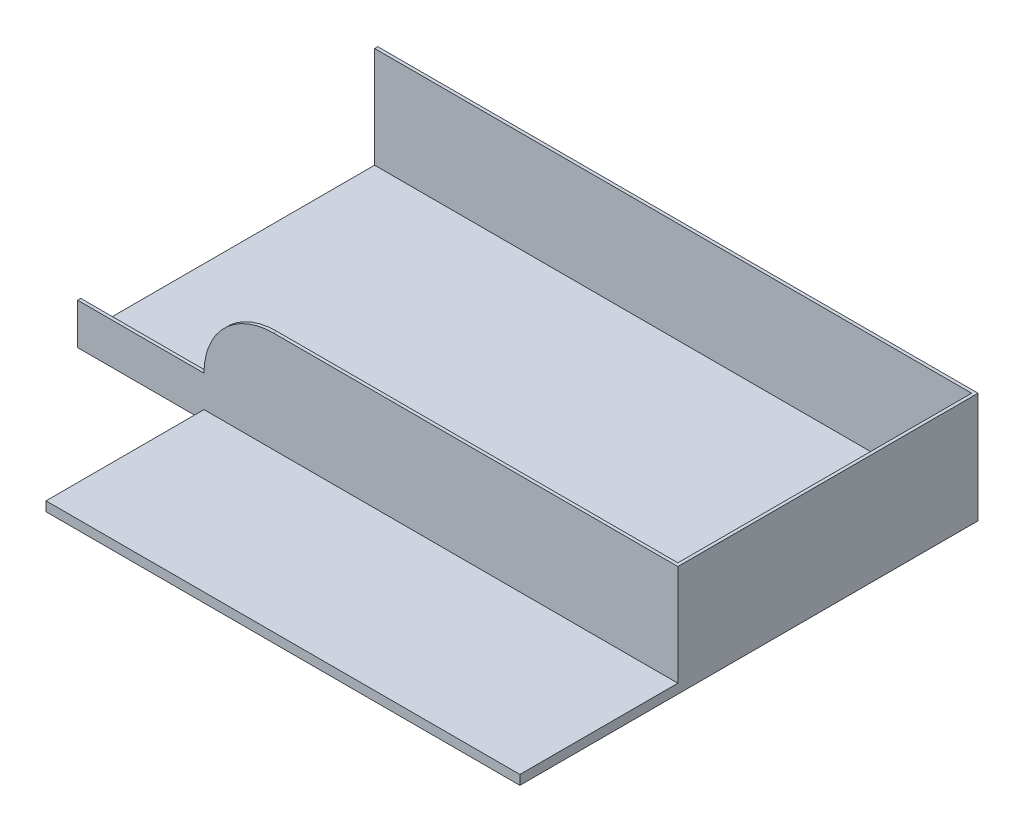
ISO-10303-21;
HEADER;
FILE_DESCRIPTION(('STEP AP214'),'2;1');
FILE_NAME('part.step','',(''),(''),'','','');
FILE_SCHEMA(('AUTOMOTIVE_DESIGN { 1 0 10303 214 1 1 1 1 }'));
ENDSEC;
DATA;
#1=APPLICATION_CONTEXT('core data for automotive mechanical design processes');
#2=APPLICATION_PROTOCOL_DEFINITION('international standard','automotive_design',2000,#1);
#3=PRODUCT_CONTEXT('',#1,'mechanical');
#4=PRODUCT('Part','Part','',(#3));
#5=PRODUCT_RELATED_PRODUCT_CATEGORY('part','',(#4));
#6=PRODUCT_DEFINITION_FORMATION('','',#4);
#7=PRODUCT_DEFINITION_CONTEXT('part definition',#1,'design');
#8=PRODUCT_DEFINITION('design','',#6,#7);
#9=PRODUCT_DEFINITION_SHAPE('','',#8);
#10=(LENGTH_UNIT() NAMED_UNIT(*) SI_UNIT(.MILLI.,.METRE.));
#11=(NAMED_UNIT(*) PLANE_ANGLE_UNIT() SI_UNIT($,.RADIAN.));
#12=(NAMED_UNIT(*) SI_UNIT($,.STERADIAN.) SOLID_ANGLE_UNIT());
#13=UNCERTAINTY_MEASURE_WITH_UNIT(LENGTH_MEASURE(1.E-05),#10,'distance_accuracy_value','');
#14=(GEOMETRIC_REPRESENTATION_CONTEXT(3) GLOBAL_UNCERTAINTY_ASSIGNED_CONTEXT((#13)) GLOBAL_UNIT_ASSIGNED_CONTEXT((#10,
#11,#12)) REPRESENTATION_CONTEXT('',''));
#15=CARTESIAN_POINT('',(0.,0.,0.));
#16=DIRECTION('',(0.,0.,1.));
#17=DIRECTION('',(1.,0.,0.));
#18=AXIS2_PLACEMENT_3D('',#15,#16,#17);
#19=CARTESIAN_POINT('',(0.,30.,0.));
#20=DIRECTION('',(0.,-1.,0.));
#21=DIRECTION('',(0.,0.,-1.));
#22=AXIS2_PLACEMENT_3D('',#19,#20,#21);
#23=PLANE('',#22);
#24=DIRECTION('',(1.,0.,0.));
#25=VECTOR('',#24,1.);
#26=CARTESIAN_POINT('',(0.,30.,940.));
#27=LINE('',#26,#25);
#28=CARTESIAN_POINT('',(1.16341445918999E-13,30.,940.));
#29=VERTEX_POINT('',#28);
#30=CARTESIAN_POINT('',(1890.,30.,940.));
#31=VERTEX_POINT('',#30);
#32=EDGE_CURVE('E164',#29,#31,#27,.T.);
#33=ORIENTED_EDGE('',*,*,#32,.T.);
#34=DIRECTION('',(0.,0.,1.));
#35=VECTOR('',#34,1.);
#36=CARTESIAN_POINT('',(1890.,30.,-4.46451386498201E-13));
#37=LINE('',#36,#35);
#38=CARTESIAN_POINT('',(1890.,30.,10.));
#39=VERTEX_POINT('',#38);
#40=EDGE_CURVE('E58',#39,#31,#37,.T.);
#41=ORIENTED_EDGE('',*,*,#40,.F.);
#42=DIRECTION('',(1.,0.,0.));
#43=VECTOR('',#42,1.);
#44=CARTESIAN_POINT('',(0.,30.,10.));
#45=LINE('',#44,#43);
#46=CARTESIAN_POINT('',(0.,30.,10.));
#47=VERTEX_POINT('',#46);
#48=EDGE_CURVE('E215',#47,#39,#45,.T.);
#49=ORIENTED_EDGE('',*,*,#48,.F.);
#50=DIRECTION('',(0.,0.,1.));
#51=VECTOR('',#50,1.);
#52=CARTESIAN_POINT('',(0.,30.,0.));
#53=LINE('',#52,#51);
#54=EDGE_CURVE('E218',#47,#29,#53,.T.);
#55=ORIENTED_EDGE('',*,*,#54,.T.);
#56=EDGE_LOOP('',(#33,#41,#49,#55));
#57=FACE_BOUND('',#56,.T.);
#58=ADVANCED_FACE('F35',(#57),#23,.F.);
#59=CARTESIAN_POINT('',(1890.,350.,-4.46451386498201E-13));
#60=DIRECTION('',(1.,0.,0.));
#61=DIRECTION('',(0.,0.,-1.));
#62=AXIS2_PLACEMENT_3D('',#59,#60,#61);
#63=PLANE('',#62);
#64=DIRECTION('',(0.,-1.,0.));
#65=VECTOR('',#64,1.);
#66=CARTESIAN_POINT('',(1890.,350.,940.));
#67=LINE('',#66,#65);
#68=CARTESIAN_POINT('',(1890.,350.,940.));
#69=VERTEX_POINT('',#68);
#70=EDGE_CURVE('E169',#69,#31,#67,.T.);
#71=ORIENTED_EDGE('',*,*,#70,.F.);
#72=DIRECTION('',(0.,0.,1.));
#73=VECTOR('',#72,1.);
#74=CARTESIAN_POINT('',(1890.,350.,-4.46451386498201E-13));
#75=LINE('',#74,#73);
#76=CARTESIAN_POINT('',(1890.,350.,10.));
#77=VERTEX_POINT('',#76);
#78=EDGE_CURVE('E195',#77,#69,#75,.T.);
#79=ORIENTED_EDGE('',*,*,#78,.F.);
#80=DIRECTION('',(0.,-1.,0.));
#81=VECTOR('',#80,1.);
#82=CARTESIAN_POINT('',(1890.,350.,10.));
#83=LINE('',#82,#81);
#84=EDGE_CURVE('E211',#77,#39,#83,.T.);
#85=ORIENTED_EDGE('',*,*,#84,.T.);
#86=ORIENTED_EDGE('',*,*,#40,.T.);
#87=EDGE_LOOP('',(#71,#79,#85,#86));
#88=FACE_BOUND('',#87,.T.);
#89=ADVANCED_FACE('F271',(#88),#63,.F.);
#90=DIRECTION('',(1.,0.,0.));
#91=VECTOR('',#90,1.);
#92=CARTESIAN_POINT('',(-2.22044604925031E-13,30.,950.));
#93=LINE('',#92,#91);
#94=CARTESIAN_POINT('',(400.,30.,950.));
#95=VERTEX_POINT('',#94);
#96=CARTESIAN_POINT('',(1900.,30.,950.));
#97=VERTEX_POINT('',#96);
#98=EDGE_CURVE('E11',#95,#97,#93,.T.);
#99=ORIENTED_EDGE('',*,*,#98,.F.);
#100=DIRECTION('',(0.,0.,-1.));
#101=VECTOR('',#100,1.);
#102=CARTESIAN_POINT('',(400.,30.,0.));
#103=LINE('',#102,#101);
#104=CARTESIAN_POINT('',(400.,30.,1450.));
#105=VERTEX_POINT('',#104);
#106=EDGE_CURVE('E177',#105,#95,#103,.T.);
#107=ORIENTED_EDGE('',*,*,#106,.F.);
#108=DIRECTION('',(-1.,0.,0.));
#109=VECTOR('',#108,1.);
#110=CARTESIAN_POINT('',(2.14643118094197E-13,30.,1450.));
#111=LINE('',#110,#109);
#112=CARTESIAN_POINT('',(1900.,30.,1450.));
#113=VERTEX_POINT('',#112);
#114=EDGE_CURVE('E173',#113,#105,#111,.T.);
#115=ORIENTED_EDGE('',*,*,#114,.F.);
#116=DIRECTION('',(0.,0.,1.));
#117=VECTOR('',#116,1.);
#118=CARTESIAN_POINT('',(1900.,30.,0.));
#119=LINE('',#118,#117);
#120=EDGE_CURVE('E51',#97,#113,#119,.T.);
#121=ORIENTED_EDGE('',*,*,#120,.F.);
#122=EDGE_LOOP('',(#99,#107,#115,#121));
#123=FACE_BOUND('',#122,.T.);
#124=ADVANCED_FACE('F258',(#123),#23,.F.);
#125=CARTESIAN_POINT('',(1.16341445918999E-13,30.,950.));
#126=DIRECTION('',(0.,0.,-1.));
#127=DIRECTION('',(-1.,0.,0.));
#128=AXIS2_PLACEMENT_3D('',#125,#126,#127);
#129=PLANE('',#128);
#130=DIRECTION('',(1.,0.,0.));
#131=VECTOR('',#130,1.);
#132=CARTESIAN_POINT('',(-2.22044604925031E-13,350.,950.));
#133=LINE('',#132,#131);
#134=CARTESIAN_POINT('',(620.,350.,950.));
#135=VERTEX_POINT('',#134);
#136=CARTESIAN_POINT('',(1900.,350.,950.));
#137=VERTEX_POINT('',#136);
#138=EDGE_CURVE('E198',#135,#137,#133,.T.);
#139=ORIENTED_EDGE('',*,*,#138,.F.);
#140=CARTESIAN_POINT('',(620.,130.,950.));
#141=DIRECTION('',(0.,0.,1.));
#142=DIRECTION('',(1.,0.,0.));
#143=AXIS2_PLACEMENT_3D('',#140,#141,#142);
#144=CIRCLE('',#143,220.);
#145=CARTESIAN_POINT('',(400.,130.,950.));
#146=VERTEX_POINT('',#145);
#147=EDGE_CURVE('E160',#146,#135,#144,.F.);
#148=ORIENTED_EDGE('',*,*,#147,.F.);
#149=DIRECTION('',(1.,0.,0.));
#150=VECTOR('',#149,1.);
#151=CARTESIAN_POINT('',(0.,130.,950.));
#152=LINE('',#151,#150);
#153=CARTESIAN_POINT('',(-2.22044604925031E-13,130.,950.));
#154=VERTEX_POINT('',#153);
#155=EDGE_CURVE('E149',#154,#146,#152,.T.);
#156=ORIENTED_EDGE('',*,*,#155,.F.);
#157=DIRECTION('',(0.,-1.,0.));
#158=VECTOR('',#157,1.);
#159=CARTESIAN_POINT('',(1.16341445918999E-13,30.,950.));
#160=LINE('',#159,#158);
#161=CARTESIAN_POINT('',(1.16341445918999E-13,0.,950.));
#162=VERTEX_POINT('',#161);
#163=EDGE_CURVE('E221',#154,#162,#160,.T.);
#164=ORIENTED_EDGE('',*,*,#163,.T.);
#165=DIRECTION('',(1.,0.,0.));
#166=VECTOR('',#165,1.);
#167=CARTESIAN_POINT('',(1.16341445918999E-13,0.,950.));
#168=LINE('',#167,#166);
#169=CARTESIAN_POINT('',(400.,0.,950.));
#170=VERTEX_POINT('',#169);
#171=EDGE_CURVE('E217',#162,#170,#168,.T.);
#172=ORIENTED_EDGE('',*,*,#171,.T.);
#173=DIRECTION('',(0.,-1.,0.));
#174=VECTOR('',#173,1.);
#175=CARTESIAN_POINT('',(400.,30.,950.));
#176=LINE('',#175,#174);
#177=EDGE_CURVE('E187',#95,#170,#176,.T.);
#178=ORIENTED_EDGE('',*,*,#177,.F.);
#179=ORIENTED_EDGE('',*,*,#98,.T.);
#180=DIRECTION('',(0.,-1.,0.));
#181=VECTOR('',#180,1.);
#182=CARTESIAN_POINT('',(1900.,30.,950.));
#183=LINE('',#182,#181);
#184=EDGE_CURVE('E39',#137,#97,#183,.T.);
#185=ORIENTED_EDGE('',*,*,#184,.F.);
#186=EDGE_LOOP('',(#139,#148,#156,#164,#172,#178,#179,#185));
#187=FACE_BOUND('',#186,.T.);
#188=ADVANCED_FACE('F37',(#187),#129,.F.);
#189=CARTESIAN_POINT('',(1900.,30.,0.));
#190=DIRECTION('',(1.,0.,0.));
#191=DIRECTION('',(0.,0.,-1.));
#192=AXIS2_PLACEMENT_3D('',#189,#190,#191);
#193=PLANE('',#192);
#194=ORIENTED_EDGE('',*,*,#184,.T.);
#195=ORIENTED_EDGE('',*,*,#120,.T.);
#196=DIRECTION('',(0.,-1.,0.));
#197=VECTOR('',#196,1.);
#198=CARTESIAN_POINT('',(1900.,30.,1450.));
#199=LINE('',#198,#197);
#200=CARTESIAN_POINT('',(1900.,0.,1450.));
#201=VERTEX_POINT('',#200);
#202=EDGE_CURVE('E189',#113,#201,#199,.T.);
#203=ORIENTED_EDGE('',*,*,#202,.T.);
#204=DIRECTION('',(0.,0.,1.));
#205=VECTOR('',#204,1.);
#206=CARTESIAN_POINT('',(1900.,0.,0.));
#207=LINE('',#206,#205);
#208=CARTESIAN_POINT('',(1900.,0.,0.));
#209=VERTEX_POINT('',#208);
#210=EDGE_CURVE('E225',#209,#201,#207,.T.);
#211=ORIENTED_EDGE('',*,*,#210,.F.);
#212=DIRECTION('',(0.,-1.,0.));
#213=VECTOR('',#212,1.);
#214=CARTESIAN_POINT('',(1900.,30.,0.));
#215=LINE('',#214,#213);
#216=CARTESIAN_POINT('',(1900.,350.,0.));
#217=VERTEX_POINT('',#216);
#218=EDGE_CURVE('E234',#217,#209,#215,.T.);
#219=ORIENTED_EDGE('',*,*,#218,.F.);
#220=DIRECTION('',(0.,0.,1.));
#221=VECTOR('',#220,1.);
#222=CARTESIAN_POINT('',(1900.,350.,-4.44089209850062E-13));
#223=LINE('',#222,#221);
#224=EDGE_CURVE('E201',#217,#137,#223,.T.);
#225=ORIENTED_EDGE('',*,*,#224,.T.);
#226=EDGE_LOOP('',(#194,#195,#203,#211,#219,#225));
#227=FACE_BOUND('',#226,.T.);
#228=ADVANCED_FACE('F241',(#227),#193,.T.);
#229=CARTESIAN_POINT('',(0.,30.,0.));
#230=DIRECTION('',(0.,0.,-1.));
#231=DIRECTION('',(-1.,0.,0.));
#232=AXIS2_PLACEMENT_3D('',#229,#230,#231);
#233=PLANE('',#232);
#234=DIRECTION('',(1.,0.,0.));
#235=VECTOR('',#234,1.);
#236=CARTESIAN_POINT('',(0.,0.,0.));
#237=LINE('',#236,#235);
#238=CARTESIAN_POINT('',(0.,0.,0.));
#239=VERTEX_POINT('',#238);
#240=EDGE_CURVE('E227',#239,#209,#237,.T.);
#241=ORIENTED_EDGE('',*,*,#240,.F.);
#242=DIRECTION('',(0.,-1.,0.));
#243=VECTOR('',#242,1.);
#244=CARTESIAN_POINT('',(0.,30.,0.));
#245=LINE('',#244,#243);
#246=CARTESIAN_POINT('',(0.,350.,0.));
#247=VERTEX_POINT('',#246);
#248=EDGE_CURVE('E233',#247,#239,#245,.T.);
#249=ORIENTED_EDGE('',*,*,#248,.F.);
#250=DIRECTION('',(1.,0.,0.));
#251=VECTOR('',#250,1.);
#252=CARTESIAN_POINT('',(0.,350.,0.));
#253=LINE('',#252,#251);
#254=EDGE_CURVE('E203',#247,#217,#253,.T.);
#255=ORIENTED_EDGE('',*,*,#254,.T.);
#256=ORIENTED_EDGE('',*,*,#218,.T.);
#257=EDGE_LOOP('',(#241,#249,#255,#256));
#258=FACE_BOUND('',#257,.T.);
#259=ADVANCED_FACE('F261',(#258),#233,.T.);
#260=CARTESIAN_POINT('',(0.,30.,0.));
#261=DIRECTION('',(1.,0.,0.));
#262=DIRECTION('',(0.,0.,-1.));
#263=AXIS2_PLACEMENT_3D('',#260,#261,#262);
#264=PLANE('',#263);
#265=DIRECTION('',(0.,0.,1.));
#266=VECTOR('',#265,1.);
#267=CARTESIAN_POINT('',(0.,0.,0.));
#268=LINE('',#267,#266);
#269=EDGE_CURVE('E222',#239,#162,#268,.T.);
#270=ORIENTED_EDGE('',*,*,#269,.T.);
#271=ORIENTED_EDGE('',*,*,#163,.F.);
#272=DIRECTION('',(0.,0.,1.));
#273=VECTOR('',#272,1.);
#274=CARTESIAN_POINT('',(-2.22044604925031E-13,130.,940.));
#275=LINE('',#274,#273);
#276=CARTESIAN_POINT('',(-2.22044604925031E-13,130.,940.));
#277=VERTEX_POINT('',#276);
#278=EDGE_CURVE('E153',#277,#154,#275,.T.);
#279=ORIENTED_EDGE('',*,*,#278,.F.);
#280=DIRECTION('',(0.,1.,0.));
#281=VECTOR('',#280,1.);
#282=CARTESIAN_POINT('',(0.,0.,940.));
#283=LINE('',#282,#281);
#284=EDGE_CURVE('E140',#29,#277,#283,.T.);
#285=ORIENTED_EDGE('',*,*,#284,.F.);
#286=ORIENTED_EDGE('',*,*,#54,.F.);
#287=DIRECTION('',(0.,-1.,0.));
#288=VECTOR('',#287,1.);
#289=CARTESIAN_POINT('',(0.,350.,10.));
#290=LINE('',#289,#288);
#291=CARTESIAN_POINT('',(0.,350.,10.));
#292=VERTEX_POINT('',#291);
#293=EDGE_CURVE('E208',#292,#47,#290,.T.);
#294=ORIENTED_EDGE('',*,*,#293,.F.);
#295=DIRECTION('',(0.,0.,1.));
#296=VECTOR('',#295,1.);
#297=CARTESIAN_POINT('',(0.,350.,0.));
#298=LINE('',#297,#296);
#299=EDGE_CURVE('E206',#247,#292,#298,.T.);
#300=ORIENTED_EDGE('',*,*,#299,.F.);
#301=ORIENTED_EDGE('',*,*,#248,.T.);
#302=EDGE_LOOP('',(#270,#271,#279,#285,#286,#294,#300,#301));
#303=FACE_BOUND('',#302,.T.);
#304=ADVANCED_FACE('F264',(#303),#264,.F.);
#305=CARTESIAN_POINT('',(0.,0.,0.));
#306=DIRECTION('',(0.,-1.,0.));
#307=DIRECTION('',(0.,0.,-1.));
#308=AXIS2_PLACEMENT_3D('',#305,#306,#307);
#309=PLANE('',#308);
#310=ORIENTED_EDGE('',*,*,#171,.F.);
#311=ORIENTED_EDGE('',*,*,#269,.F.);
#312=ORIENTED_EDGE('',*,*,#240,.T.);
#313=ORIENTED_EDGE('',*,*,#210,.T.);
#314=DIRECTION('',(-1.,0.,0.));
#315=VECTOR('',#314,1.);
#316=CARTESIAN_POINT('',(2.14643118094197E-13,0.,1450.));
#317=LINE('',#316,#315);
#318=CARTESIAN_POINT('',(400.,0.,1450.));
#319=VERTEX_POINT('',#318);
#320=EDGE_CURVE('E172',#201,#319,#317,.T.);
#321=ORIENTED_EDGE('',*,*,#320,.T.);
#322=DIRECTION('',(0.,0.,-1.));
#323=VECTOR('',#322,1.);
#324=CARTESIAN_POINT('',(400.,0.,0.));
#325=LINE('',#324,#323);
#326=EDGE_CURVE('E176',#319,#170,#325,.T.);
#327=ORIENTED_EDGE('',*,*,#326,.T.);
#328=EDGE_LOOP('',(#310,#311,#312,#313,#321,#327));
#329=FACE_BOUND('',#328,.T.);
#330=ADVANCED_FACE('F252',(#329),#309,.T.);
#331=CARTESIAN_POINT('',(0.,350.,10.));
#332=DIRECTION('',(0.,0.,-1.));
#333=DIRECTION('',(-1.,0.,0.));
#334=AXIS2_PLACEMENT_3D('',#331,#332,#333);
#335=PLANE('',#334);
#336=ORIENTED_EDGE('',*,*,#293,.T.);
#337=ORIENTED_EDGE('',*,*,#48,.T.);
#338=ORIENTED_EDGE('',*,*,#84,.F.);
#339=DIRECTION('',(1.,0.,0.));
#340=VECTOR('',#339,1.);
#341=CARTESIAN_POINT('',(0.,350.,10.));
#342=LINE('',#341,#340);
#343=EDGE_CURVE('E192',#292,#77,#342,.T.);
#344=ORIENTED_EDGE('',*,*,#343,.F.);
#345=EDGE_LOOP('',(#336,#337,#338,#344));
#346=FACE_BOUND('',#345,.T.);
#347=ADVANCED_FACE('F268',(#346),#335,.F.);
#348=CARTESIAN_POINT('',(0.,350.,0.));
#349=DIRECTION('',(0.,1.,0.));
#350=DIRECTION('',(0.,0.,1.));
#351=AXIS2_PLACEMENT_3D('',#348,#349,#350);
#352=PLANE('',#351);
#353=ORIENTED_EDGE('',*,*,#138,.T.);
#354=ORIENTED_EDGE('',*,*,#224,.F.);
#355=ORIENTED_EDGE('',*,*,#254,.F.);
#356=ORIENTED_EDGE('',*,*,#299,.T.);
#357=ORIENTED_EDGE('',*,*,#343,.T.);
#358=ORIENTED_EDGE('',*,*,#78,.T.);
#359=DIRECTION('',(1.,0.,0.));
#360=VECTOR('',#359,1.);
#361=CARTESIAN_POINT('',(0.,350.,940.));
#362=LINE('',#361,#360);
#363=CARTESIAN_POINT('',(620.,350.,940.));
#364=VERTEX_POINT('',#363);
#365=EDGE_CURVE('E154',#364,#69,#362,.T.);
#366=ORIENTED_EDGE('',*,*,#365,.F.);
#367=DIRECTION('',(0.,0.,1.));
#368=VECTOR('',#367,1.);
#369=CARTESIAN_POINT('',(620.,350.,940.));
#370=LINE('',#369,#368);
#371=EDGE_CURVE('E158',#364,#135,#370,.T.);
#372=ORIENTED_EDGE('',*,*,#371,.T.);
#373=EDGE_LOOP('',(#353,#354,#355,#356,#357,#358,#366,#372));
#374=FACE_BOUND('',#373,.T.);
#375=ADVANCED_FACE('F246',(#374),#352,.T.);
#376=CARTESIAN_POINT('',(2.14643118094197E-13,30.,1450.));
#377=DIRECTION('',(0.,0.,1.));
#378=DIRECTION('',(1.,0.,0.));
#379=AXIS2_PLACEMENT_3D('',#376,#377,#378);
#380=PLANE('',#379);
#381=ORIENTED_EDGE('',*,*,#320,.F.);
#382=ORIENTED_EDGE('',*,*,#202,.F.);
#383=ORIENTED_EDGE('',*,*,#114,.T.);
#384=DIRECTION('',(0.,-1.,0.));
#385=VECTOR('',#384,1.);
#386=CARTESIAN_POINT('',(400.,30.,1450.));
#387=LINE('',#386,#385);
#388=EDGE_CURVE('E181',#105,#319,#387,.T.);
#389=ORIENTED_EDGE('',*,*,#388,.T.);
#390=EDGE_LOOP('',(#381,#382,#383,#389));
#391=FACE_BOUND('',#390,.T.);
#392=ADVANCED_FACE('F260',(#391),#380,.T.);
#393=CARTESIAN_POINT('',(400.,30.,0.));
#394=DIRECTION('',(-1.,0.,0.));
#395=DIRECTION('',(0.,0.,1.));
#396=AXIS2_PLACEMENT_3D('',#393,#394,#395);
#397=PLANE('',#396);
#398=ORIENTED_EDGE('',*,*,#326,.F.);
#399=ORIENTED_EDGE('',*,*,#388,.F.);
#400=ORIENTED_EDGE('',*,*,#106,.T.);
#401=ORIENTED_EDGE('',*,*,#177,.T.);
#402=EDGE_LOOP('',(#398,#399,#400,#401));
#403=FACE_BOUND('',#402,.T.);
#404=ADVANCED_FACE('F256',(#403),#397,.T.);
#405=CARTESIAN_POINT('',(0.,0.,940.));
#406=DIRECTION('',(0.,0.,1.));
#407=DIRECTION('',(1.,0.,0.));
#408=AXIS2_PLACEMENT_3D('',#405,#406,#407);
#409=PLANE('',#408);
#410=ORIENTED_EDGE('',*,*,#365,.T.);
#411=ORIENTED_EDGE('',*,*,#70,.T.);
#412=ORIENTED_EDGE('',*,*,#32,.F.);
#413=ORIENTED_EDGE('',*,*,#284,.T.);
#414=DIRECTION('',(1.,0.,0.));
#415=VECTOR('',#414,1.);
#416=CARTESIAN_POINT('',(0.,130.,940.));
#417=LINE('',#416,#415);
#418=CARTESIAN_POINT('',(400.,130.,940.));
#419=VERTEX_POINT('',#418);
#420=EDGE_CURVE('E133',#277,#419,#417,.T.);
#421=ORIENTED_EDGE('',*,*,#420,.T.);
#422=CARTESIAN_POINT('',(620.,130.,940.));
#423=DIRECTION('',(0.,0.,1.));
#424=DIRECTION('',(1.,0.,0.));
#425=AXIS2_PLACEMENT_3D('',#422,#423,#424);
#426=CIRCLE('',#425,220.);
#427=EDGE_CURVE('E137',#419,#364,#426,.F.);
#428=ORIENTED_EDGE('',*,*,#427,.T.);
#429=EDGE_LOOP('',(#410,#411,#412,#413,#421,#428));
#430=FACE_BOUND('',#429,.T.);
#431=ADVANCED_FACE('F135',(#430),#409,.F.);
#432=CARTESIAN_POINT('',(620.,130.,940.));
#433=DIRECTION('',(0.,0.,1.));
#434=DIRECTION('',(1.,0.,0.));
#435=AXIS2_PLACEMENT_3D('',#432,#433,#434);
#436=CYLINDRICAL_SURFACE('',#435,220.);
#437=ORIENTED_EDGE('',*,*,#147,.T.);
#438=ORIENTED_EDGE('',*,*,#371,.F.);
#439=ORIENTED_EDGE('',*,*,#427,.F.);
#440=DIRECTION('',(0.,0.,1.));
#441=VECTOR('',#440,1.);
#442=CARTESIAN_POINT('',(400.,130.,940.));
#443=LINE('',#442,#441);
#444=EDGE_CURVE('E146',#419,#146,#443,.T.);
#445=ORIENTED_EDGE('',*,*,#444,.T.);
#446=EDGE_LOOP('',(#437,#438,#439,#445));
#447=FACE_BOUND('',#446,.T.);
#448=ADVANCED_FACE('F156',(#447),#436,.T.);
#449=CARTESIAN_POINT('',(0.,130.,940.));
#450=DIRECTION('',(0.,-1.,0.));
#451=DIRECTION('',(0.,0.,-1.));
#452=AXIS2_PLACEMENT_3D('',#449,#450,#451);
#453=PLANE('',#452);
#454=ORIENTED_EDGE('',*,*,#155,.T.);
#455=ORIENTED_EDGE('',*,*,#444,.F.);
#456=ORIENTED_EDGE('',*,*,#420,.F.);
#457=ORIENTED_EDGE('',*,*,#278,.T.);
#458=EDGE_LOOP('',(#454,#455,#456,#457));
#459=FACE_BOUND('',#458,.T.);
#460=ADVANCED_FACE('F147',(#459),#453,.F.);
#461=CLOSED_SHELL('',(#58,#89,#124,#188,#228,#259,#304,#330,#347,#375,#392,#404,#431,#448,#460));
#462=MANIFOLD_SOLID_BREP('B2',#461);
#463=ADVANCED_BREP_SHAPE_REPRESENTATION('',(#18,#462),#14);
#464=SHAPE_DEFINITION_REPRESENTATION(#9,#463);
ENDSEC;
END-ISO-10303-21;
